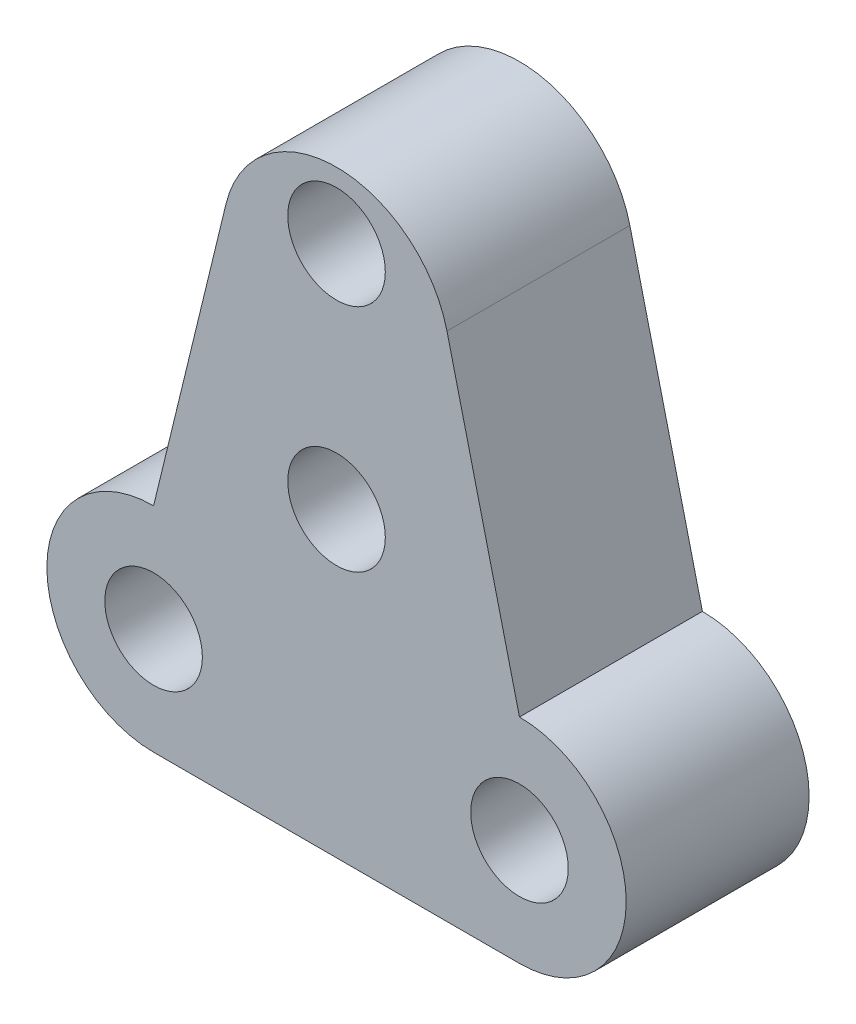
ISO-10303-21;
HEADER;
FILE_DESCRIPTION(('STEP AP214'),'2;1');
FILE_NAME('part.step','',(''),(''),'','','');
FILE_SCHEMA(('AUTOMOTIVE_DESIGN { 1 0 10303 214 1 1 1 1 }'));
ENDSEC;
DATA;
#1=APPLICATION_CONTEXT('core data for automotive mechanical design processes');
#2=APPLICATION_PROTOCOL_DEFINITION('international standard','automotive_design',2000,#1);
#3=PRODUCT_CONTEXT('',#1,'mechanical');
#4=PRODUCT('Part','Part','',(#3));
#5=PRODUCT_RELATED_PRODUCT_CATEGORY('part','',(#4));
#6=PRODUCT_DEFINITION_FORMATION('','',#4);
#7=PRODUCT_DEFINITION_CONTEXT('part definition',#1,'design');
#8=PRODUCT_DEFINITION('design','',#6,#7);
#9=PRODUCT_DEFINITION_SHAPE('','',#8);
#10=(LENGTH_UNIT() NAMED_UNIT(*) SI_UNIT(.MILLI.,.METRE.));
#11=(NAMED_UNIT(*) PLANE_ANGLE_UNIT() SI_UNIT($,.RADIAN.));
#12=(NAMED_UNIT(*) SI_UNIT($,.STERADIAN.) SOLID_ANGLE_UNIT());
#13=UNCERTAINTY_MEASURE_WITH_UNIT(LENGTH_MEASURE(1.E-05),#10,'distance_accuracy_value','');
#14=(GEOMETRIC_REPRESENTATION_CONTEXT(3) GLOBAL_UNCERTAINTY_ASSIGNED_CONTEXT((#13)) GLOBAL_UNIT_ASSIGNED_CONTEXT((#10,
#11,#12)) REPRESENTATION_CONTEXT('',''));
#15=CARTESIAN_POINT('',(0.,0.,0.));
#16=DIRECTION('',(0.,0.,1.));
#17=DIRECTION('',(1.,0.,0.));
#18=AXIS2_PLACEMENT_3D('',#15,#16,#17);
#19=CARTESIAN_POINT('',(0.,15.8923366867947,6.));
#20=DIRECTION('',(0.,0.,-1.));
#21=DIRECTION('',(-1.,0.,0.));
#22=AXIS2_PLACEMENT_3D('',#19,#20,#21);
#23=CYLINDRICAL_SURFACE('',#22,3.72766331320526);
#24=DIRECTION('',(0.,0.,-1.));
#25=VECTOR('',#24,1.);
#26=CARTESIAN_POINT('',(-3.62199497081246,16.7736006699608,6.));
#27=LINE('',#26,#25);
#28=CARTESIAN_POINT('',(-3.62199497081246,16.7736006699608,6.));
#29=VERTEX_POINT('',#28);
#30=CARTESIAN_POINT('',(-3.62199497081246,16.7736006699608,0.));
#31=VERTEX_POINT('',#30);
#32=EDGE_CURVE('E125',#29,#31,#27,.T.);
#33=ORIENTED_EDGE('',*,*,#32,.F.);
#34=CARTESIAN_POINT('',(0.,15.8923366867947,6.));
#35=DIRECTION('',(0.,0.,-1.));
#36=DIRECTION('',(-1.,0.,0.));
#37=AXIS2_PLACEMENT_3D('',#34,#35,#36);
#38=CIRCLE('',#37,3.72766331320526);
#39=CARTESIAN_POINT('',(3.62199497081246,16.7736006699608,6.));
#40=VERTEX_POINT('',#39);
#41=EDGE_CURVE('E53',#40,#29,#38,.F.);
#42=ORIENTED_EDGE('',*,*,#41,.F.);
#43=DIRECTION('',(0.,0.,-1.));
#44=VECTOR('',#43,1.);
#45=CARTESIAN_POINT('',(3.62199497081246,16.7736006699608,6.));
#46=LINE('',#45,#44);
#47=CARTESIAN_POINT('',(3.62199497081246,16.7736006699608,0.));
#48=VERTEX_POINT('',#47);
#49=EDGE_CURVE('E130',#48,#40,#46,.F.);
#50=ORIENTED_EDGE('',*,*,#49,.F.);
#51=CARTESIAN_POINT('',(0.,15.8923366867947,0.));
#52=DIRECTION('',(0.,0.,-1.));
#53=DIRECTION('',(-1.,0.,0.));
#54=AXIS2_PLACEMENT_3D('',#51,#52,#53);
#55=CIRCLE('',#54,3.72766331320526);
#56=EDGE_CURVE('E12',#31,#48,#55,.T.);
#57=ORIENTED_EDGE('',*,*,#56,.F.);
#58=EDGE_LOOP('',(#33,#42,#50,#57));
#59=FACE_BOUND('',#58,.T.);
#60=ADVANCED_FACE('F44',(#59),#23,.T.);
#61=CARTESIAN_POINT('',(-6.,3.5,6.));
#62=DIRECTION('',(0.,0.,-1.));
#63=DIRECTION('',(-1.,0.,0.));
#64=AXIS2_PLACEMENT_3D('',#61,#62,#63);
#65=PLANE('',#64);
#66=DIRECTION('',(-0.236411904488307,0.971652927446942,0.));
#67=VECTOR('',#66,1.);
#68=CARTESIAN_POINT('',(6.,7.,6.));
#69=LINE('',#68,#67);
#70=CARTESIAN_POINT('',(6.,7.,6.));
#71=VERTEX_POINT('',#70);
#72=EDGE_CURVE('E139',#71,#40,#69,.T.);
#73=ORIENTED_EDGE('',*,*,#72,.T.);
#74=ORIENTED_EDGE('',*,*,#41,.T.);
#75=DIRECTION('',(-0.236411904488307,-0.971652927446942,0.));
#76=VECTOR('',#75,1.);
#77=CARTESIAN_POINT('',(-4.,15.22,6.));
#78=LINE('',#77,#76);
#79=CARTESIAN_POINT('',(-6.,7.,6.));
#80=VERTEX_POINT('',#79);
#81=EDGE_CURVE('E114',#29,#80,#78,.T.);
#82=ORIENTED_EDGE('',*,*,#81,.T.);
#83=CARTESIAN_POINT('',(-6.,3.5,6.));
#84=DIRECTION('',(0.,0.,1.));
#85=DIRECTION('',(-1.,0.,0.));
#86=AXIS2_PLACEMENT_3D('',#83,#84,#85);
#87=CIRCLE('',#86,3.5);
#88=CARTESIAN_POINT('',(-6.,0.,6.));
#89=VERTEX_POINT('',#88);
#90=EDGE_CURVE('E107',#80,#89,#87,.T.);
#91=ORIENTED_EDGE('',*,*,#90,.T.);
#92=DIRECTION('',(1.,0.,0.));
#93=VECTOR('',#92,1.);
#94=CARTESIAN_POINT('',(-6.,0.,6.));
#95=LINE('',#94,#93);
#96=CARTESIAN_POINT('',(6.,0.,6.));
#97=VERTEX_POINT('',#96);
#98=EDGE_CURVE('E95',#89,#97,#95,.T.);
#99=ORIENTED_EDGE('',*,*,#98,.T.);
#100=CARTESIAN_POINT('',(6.,3.5,6.));
#101=DIRECTION('',(0.,0.,1.));
#102=DIRECTION('',(1.,0.,0.));
#103=AXIS2_PLACEMENT_3D('',#100,#101,#102);
#104=CIRCLE('',#103,3.5);
#105=EDGE_CURVE('E106',#97,#71,#104,.T.);
#106=ORIENTED_EDGE('',*,*,#105,.T.);
#107=EDGE_LOOP('',(#73,#74,#82,#91,#99,#106));
#108=FACE_BOUND('',#107,.T.);
#109=CARTESIAN_POINT('',(6.,3.5,6.));
#110=DIRECTION('',(0.,0.,1.));
#111=DIRECTION('',(1.,0.,0.));
#112=AXIS2_PLACEMENT_3D('',#109,#110,#111);
#113=CIRCLE('',#112,1.6);
#114=CARTESIAN_POINT('',(7.6,3.5,6.));
#115=VERTEX_POINT('',#114);
#116=EDGE_CURVE('E154',#115,#115,#113,.T.);
#117=ORIENTED_EDGE('',*,*,#116,.F.);
#118=EDGE_LOOP('',(#117));
#119=FACE_BOUND('',#118,.T.);
#120=CARTESIAN_POINT('',(-6.,3.5,6.));
#121=DIRECTION('',(0.,0.,1.));
#122=DIRECTION('',(1.,0.,0.));
#123=AXIS2_PLACEMENT_3D('',#120,#121,#122);
#124=CIRCLE('',#123,1.6);
#125=CARTESIAN_POINT('',(-4.4,3.5,6.));
#126=VERTEX_POINT('',#125);
#127=EDGE_CURVE('E202',#126,#126,#124,.T.);
#128=ORIENTED_EDGE('',*,*,#127,.F.);
#129=EDGE_LOOP('',(#128));
#130=FACE_BOUND('',#129,.T.);
#131=CARTESIAN_POINT('',(0.,17.44,6.));
#132=DIRECTION('',(0.,0.,1.));
#133=DIRECTION('',(1.,0.,0.));
#134=AXIS2_PLACEMENT_3D('',#131,#132,#133);
#135=CIRCLE('',#134,1.6);
#136=CARTESIAN_POINT('',(1.6,17.44,6.));
#137=VERTEX_POINT('',#136);
#138=EDGE_CURVE('E195',#137,#137,#135,.T.);
#139=ORIENTED_EDGE('',*,*,#138,.F.);
#140=EDGE_LOOP('',(#139));
#141=FACE_BOUND('',#140,.T.);
#142=CARTESIAN_POINT('',(0.,9.9,6.));
#143=DIRECTION('',(0.,0.,1.));
#144=DIRECTION('',(1.,0.,0.));
#145=AXIS2_PLACEMENT_3D('',#142,#143,#144);
#146=CIRCLE('',#145,1.6);
#147=CARTESIAN_POINT('',(1.6,9.9,6.));
#148=VERTEX_POINT('',#147);
#149=EDGE_CURVE('E188',#148,#148,#146,.T.);
#150=ORIENTED_EDGE('',*,*,#149,.F.);
#151=EDGE_LOOP('',(#150));
#152=FACE_BOUND('',#151,.T.);
#153=ADVANCED_FACE('F111',(#108,#119,#130,#141,#152),#65,.F.);
#154=CARTESIAN_POINT('',(-6.,3.5,0.));
#155=DIRECTION('',(0.,0.,-1.));
#156=DIRECTION('',(-1.,0.,0.));
#157=AXIS2_PLACEMENT_3D('',#154,#155,#156);
#158=PLANE('',#157);
#159=CARTESIAN_POINT('',(0.,17.44,0.));
#160=DIRECTION('',(0.,0.,1.));
#161=DIRECTION('',(1.,0.,0.));
#162=AXIS2_PLACEMENT_3D('',#159,#160,#161);
#163=CIRCLE('',#162,1.6);
#164=CARTESIAN_POINT('',(1.6,17.44,0.));
#165=VERTEX_POINT('',#164);
#166=EDGE_CURVE('E192',#165,#165,#163,.T.);
#167=ORIENTED_EDGE('',*,*,#166,.T.);
#168=EDGE_LOOP('',(#167));
#169=FACE_BOUND('',#168,.T.);
#170=CARTESIAN_POINT('',(6.,3.5,0.));
#171=DIRECTION('',(0.,0.,1.));
#172=DIRECTION('',(1.,0.,0.));
#173=AXIS2_PLACEMENT_3D('',#170,#171,#172);
#174=CIRCLE('',#173,1.6);
#175=CARTESIAN_POINT('',(7.6,3.5,0.));
#176=VERTEX_POINT('',#175);
#177=EDGE_CURVE('E206',#176,#176,#174,.T.);
#178=ORIENTED_EDGE('',*,*,#177,.T.);
#179=EDGE_LOOP('',(#178));
#180=FACE_BOUND('',#179,.T.);
#181=DIRECTION('',(-0.236411904488307,-0.971652927446942,0.));
#182=VECTOR('',#181,1.);
#183=CARTESIAN_POINT('',(-6.,7.,0.));
#184=LINE('',#183,#182);
#185=CARTESIAN_POINT('',(-6.,7.,0.));
#186=VERTEX_POINT('',#185);
#187=EDGE_CURVE('E119',#31,#186,#184,.T.);
#188=ORIENTED_EDGE('',*,*,#187,.F.);
#189=ORIENTED_EDGE('',*,*,#56,.T.);
#190=DIRECTION('',(-0.236411904488307,0.971652927446942,0.));
#191=VECTOR('',#190,1.);
#192=CARTESIAN_POINT('',(2.9294403892944,19.62,0.));
#193=LINE('',#192,#191);
#194=CARTESIAN_POINT('',(6.,7.,0.));
#195=VERTEX_POINT('',#194);
#196=EDGE_CURVE('E161',#195,#48,#193,.T.);
#197=ORIENTED_EDGE('',*,*,#196,.F.);
#198=CARTESIAN_POINT('',(6.,3.5,0.));
#199=DIRECTION('',(0.,0.,1.));
#200=DIRECTION('',(1.,0.,0.));
#201=AXIS2_PLACEMENT_3D('',#198,#199,#200);
#202=CIRCLE('',#201,3.5);
#203=CARTESIAN_POINT('',(6.,0.,0.));
#204=VERTEX_POINT('',#203);
#205=EDGE_CURVE('E157',#204,#195,#202,.T.);
#206=ORIENTED_EDGE('',*,*,#205,.F.);
#207=DIRECTION('',(1.,0.,0.));
#208=VECTOR('',#207,1.);
#209=CARTESIAN_POINT('',(-6.,0.,0.));
#210=LINE('',#209,#208);
#211=CARTESIAN_POINT('',(-6.,0.,0.));
#212=VERTEX_POINT('',#211);
#213=EDGE_CURVE('E153',#212,#204,#210,.T.);
#214=ORIENTED_EDGE('',*,*,#213,.F.);
#215=CARTESIAN_POINT('',(-6.,3.5,0.));
#216=DIRECTION('',(0.,0.,1.));
#217=DIRECTION('',(-1.,0.,0.));
#218=AXIS2_PLACEMENT_3D('',#215,#216,#217);
#219=CIRCLE('',#218,3.5);
#220=EDGE_CURVE('E123',#186,#212,#219,.T.);
#221=ORIENTED_EDGE('',*,*,#220,.F.);
#222=EDGE_LOOP('',(#188,#189,#197,#206,#214,#221));
#223=FACE_BOUND('',#222,.T.);
#224=CARTESIAN_POINT('',(-6.,3.5,0.));
#225=DIRECTION('',(0.,0.,1.));
#226=DIRECTION('',(1.,0.,0.));
#227=AXIS2_PLACEMENT_3D('',#224,#225,#226);
#228=CIRCLE('',#227,1.6);
#229=CARTESIAN_POINT('',(-4.4,3.5,0.));
#230=VERTEX_POINT('',#229);
#231=EDGE_CURVE('E182',#230,#230,#228,.T.);
#232=ORIENTED_EDGE('',*,*,#231,.T.);
#233=EDGE_LOOP('',(#232));
#234=FACE_BOUND('',#233,.T.);
#235=CARTESIAN_POINT('',(0.,9.9,0.));
#236=DIRECTION('',(0.,0.,1.));
#237=DIRECTION('',(1.,0.,0.));
#238=AXIS2_PLACEMENT_3D('',#235,#236,#237);
#239=CIRCLE('',#238,1.6);
#240=CARTESIAN_POINT('',(1.6,9.9,0.));
#241=VERTEX_POINT('',#240);
#242=EDGE_CURVE('E185',#241,#241,#239,.T.);
#243=ORIENTED_EDGE('',*,*,#242,.T.);
#244=EDGE_LOOP('',(#243));
#245=FACE_BOUND('',#244,.T.);
#246=ADVANCED_FACE('F174',(#169,#180,#223,#234,#245),#158,.T.);
#247=CARTESIAN_POINT('',(-6.,3.5,6.));
#248=DIRECTION('',(0.,0.,-1.));
#249=DIRECTION('',(-1.,0.,0.));
#250=AXIS2_PLACEMENT_3D('',#247,#248,#249);
#251=CYLINDRICAL_SURFACE('',#250,3.5);
#252=ORIENTED_EDGE('',*,*,#220,.T.);
#253=DIRECTION('',(0.,0.,-1.));
#254=VECTOR('',#253,1.);
#255=CARTESIAN_POINT('',(-6.,0.,6.));
#256=LINE('',#255,#254);
#257=EDGE_CURVE('E99',#89,#212,#256,.T.);
#258=ORIENTED_EDGE('',*,*,#257,.F.);
#259=ORIENTED_EDGE('',*,*,#90,.F.);
#260=DIRECTION('',(0.,0.,-1.));
#261=VECTOR('',#260,1.);
#262=CARTESIAN_POINT('',(-6.,7.,6.));
#263=LINE('',#262,#261);
#264=EDGE_CURVE('E142',#80,#186,#263,.T.);
#265=ORIENTED_EDGE('',*,*,#264,.T.);
#266=EDGE_LOOP('',(#252,#258,#259,#265));
#267=FACE_BOUND('',#266,.T.);
#268=ADVANCED_FACE('F121',(#267),#251,.T.);
#269=CARTESIAN_POINT('',(-6.,0.,6.));
#270=DIRECTION('',(0.,1.,0.));
#271=DIRECTION('',(0.,0.,1.));
#272=AXIS2_PLACEMENT_3D('',#269,#270,#271);
#273=PLANE('',#272);
#274=ORIENTED_EDGE('',*,*,#213,.T.);
#275=DIRECTION('',(0.,0.,-1.));
#276=VECTOR('',#275,1.);
#277=CARTESIAN_POINT('',(6.,0.,6.));
#278=LINE('',#277,#276);
#279=EDGE_CURVE('E102',#97,#204,#278,.T.);
#280=ORIENTED_EDGE('',*,*,#279,.F.);
#281=ORIENTED_EDGE('',*,*,#98,.F.);
#282=ORIENTED_EDGE('',*,*,#257,.T.);
#283=EDGE_LOOP('',(#274,#280,#281,#282));
#284=FACE_BOUND('',#283,.T.);
#285=ADVANCED_FACE('F97',(#284),#273,.F.);
#286=CARTESIAN_POINT('',(6.,3.5,6.));
#287=DIRECTION('',(0.,0.,-1.));
#288=DIRECTION('',(-1.,0.,0.));
#289=AXIS2_PLACEMENT_3D('',#286,#287,#288);
#290=CYLINDRICAL_SURFACE('',#289,3.5);
#291=ORIENTED_EDGE('',*,*,#205,.T.);
#292=DIRECTION('',(0.,0.,-1.));
#293=VECTOR('',#292,1.);
#294=CARTESIAN_POINT('',(6.,7.,6.));
#295=LINE('',#294,#293);
#296=EDGE_CURVE('E132',#71,#195,#295,.T.);
#297=ORIENTED_EDGE('',*,*,#296,.F.);
#298=ORIENTED_EDGE('',*,*,#105,.F.);
#299=ORIENTED_EDGE('',*,*,#279,.T.);
#300=EDGE_LOOP('',(#291,#297,#298,#299));
#301=FACE_BOUND('',#300,.T.);
#302=ADVANCED_FACE('F172',(#301),#290,.T.);
#303=CARTESIAN_POINT('',(2.9294403892944,19.62,6.));
#304=DIRECTION('',(-0.971652927446942,-0.236411904488307,0.));
#305=DIRECTION('',(0.236411904488307,-0.971652927446942,0.));
#306=AXIS2_PLACEMENT_3D('',#303,#304,#305);
#307=PLANE('',#306);
#308=ORIENTED_EDGE('',*,*,#196,.T.);
#309=ORIENTED_EDGE('',*,*,#49,.T.);
#310=ORIENTED_EDGE('',*,*,#72,.F.);
#311=ORIENTED_EDGE('',*,*,#296,.T.);
#312=EDGE_LOOP('',(#308,#309,#310,#311));
#313=FACE_BOUND('',#312,.T.);
#314=ADVANCED_FACE('F170',(#313),#307,.F.);
#315=CARTESIAN_POINT('',(-6.,7.,6.));
#316=DIRECTION('',(0.971652927446942,-0.236411904488307,0.));
#317=DIRECTION('',(0.236411904488307,0.971652927446942,0.));
#318=AXIS2_PLACEMENT_3D('',#315,#316,#317);
#319=PLANE('',#318);
#320=ORIENTED_EDGE('',*,*,#81,.F.);
#321=ORIENTED_EDGE('',*,*,#32,.T.);
#322=ORIENTED_EDGE('',*,*,#187,.T.);
#323=ORIENTED_EDGE('',*,*,#264,.F.);
#324=EDGE_LOOP('',(#320,#321,#322,#323));
#325=FACE_BOUND('',#324,.T.);
#326=ADVANCED_FACE('F141',(#325),#319,.F.);
#327=CARTESIAN_POINT('',(6.,3.5,6.));
#328=DIRECTION('',(0.,0.,-1.));
#329=DIRECTION('',(-1.,0.,0.));
#330=AXIS2_PLACEMENT_3D('',#327,#328,#329);
#331=CYLINDRICAL_SURFACE('',#330,1.6);
#332=ORIENTED_EDGE('',*,*,#116,.T.);
#333=EDGE_LOOP('',(#332));
#334=FACE_BOUND('',#333,.T.);
#335=ORIENTED_EDGE('',*,*,#177,.F.);
#336=EDGE_LOOP('',(#335));
#337=FACE_BOUND('',#336,.T.);
#338=ADVANCED_FACE('F218',(#334,#337),#331,.F.);
#339=CARTESIAN_POINT('',(-6.,3.5,6.));
#340=DIRECTION('',(0.,0.,-1.));
#341=DIRECTION('',(-1.,0.,0.));
#342=AXIS2_PLACEMENT_3D('',#339,#340,#341);
#343=CYLINDRICAL_SURFACE('',#342,1.6);
#344=ORIENTED_EDGE('',*,*,#127,.T.);
#345=EDGE_LOOP('',(#344));
#346=FACE_BOUND('',#345,.T.);
#347=ORIENTED_EDGE('',*,*,#231,.F.);
#348=EDGE_LOOP('',(#347));
#349=FACE_BOUND('',#348,.T.);
#350=ADVANCED_FACE('F220',(#346,#349),#343,.F.);
#351=CARTESIAN_POINT('',(0.,17.44,6.));
#352=DIRECTION('',(0.,0.,-1.));
#353=DIRECTION('',(-1.,0.,0.));
#354=AXIS2_PLACEMENT_3D('',#351,#352,#353);
#355=CYLINDRICAL_SURFACE('',#354,1.6);
#356=ORIENTED_EDGE('',*,*,#138,.T.);
#357=EDGE_LOOP('',(#356));
#358=FACE_BOUND('',#357,.T.);
#359=ORIENTED_EDGE('',*,*,#166,.F.);
#360=EDGE_LOOP('',(#359));
#361=FACE_BOUND('',#360,.T.);
#362=ADVANCED_FACE('F227',(#358,#361),#355,.F.);
#363=CARTESIAN_POINT('',(0.,9.9,6.));
#364=DIRECTION('',(0.,0.,-1.));
#365=DIRECTION('',(-1.,0.,0.));
#366=AXIS2_PLACEMENT_3D('',#363,#364,#365);
#367=CYLINDRICAL_SURFACE('',#366,1.6);
#368=ORIENTED_EDGE('',*,*,#149,.T.);
#369=EDGE_LOOP('',(#368));
#370=FACE_BOUND('',#369,.T.);
#371=ORIENTED_EDGE('',*,*,#242,.F.);
#372=EDGE_LOOP('',(#371));
#373=FACE_BOUND('',#372,.T.);
#374=ADVANCED_FACE('F287',(#370,#373),#367,.F.);
#375=CLOSED_SHELL('',(#60,#153,#246,#268,#285,#302,#314,#326,#338,#350,#362,#374));
#376=MANIFOLD_SOLID_BREP('B2',#375);
#377=ADVANCED_BREP_SHAPE_REPRESENTATION('',(#18,#376),#14);
#378=SHAPE_DEFINITION_REPRESENTATION(#9,#377);
ENDSEC;
END-ISO-10303-21;
